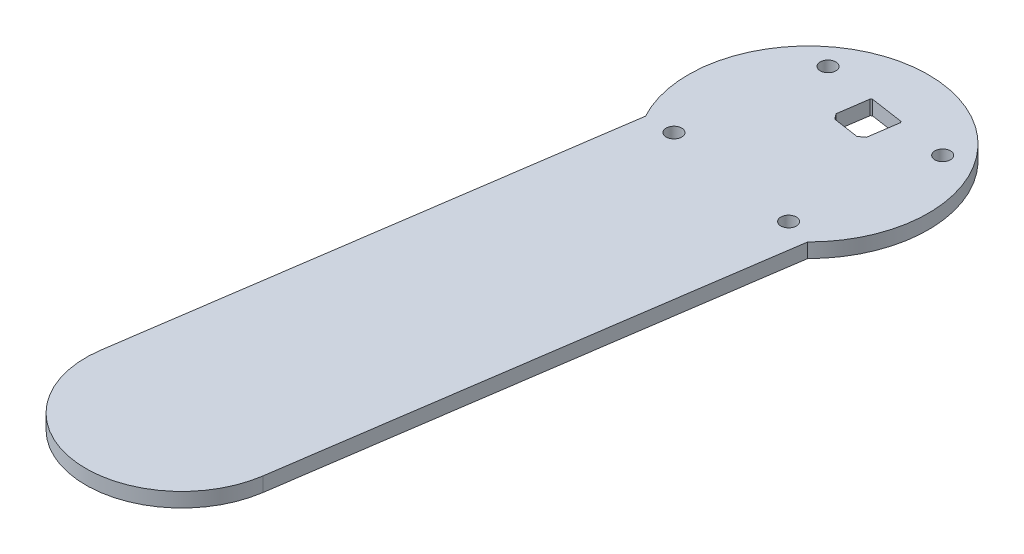
ISO-10303-21;
HEADER;
FILE_DESCRIPTION(('STEP AP214'),'2;1');
FILE_NAME('part.step','',(''),(''),'','','');
FILE_SCHEMA(('AUTOMOTIVE_DESIGN { 1 0 10303 214 1 1 1 1 }'));
ENDSEC;
DATA;
#1=APPLICATION_CONTEXT('core data for automotive mechanical design processes');
#2=APPLICATION_PROTOCOL_DEFINITION('international standard','automotive_design',2000,#1);
#3=PRODUCT_CONTEXT('',#1,'mechanical');
#4=PRODUCT('Part','Part','',(#3));
#5=PRODUCT_RELATED_PRODUCT_CATEGORY('part','',(#4));
#6=PRODUCT_DEFINITION_FORMATION('','',#4);
#7=PRODUCT_DEFINITION_CONTEXT('part definition',#1,'design');
#8=PRODUCT_DEFINITION('design','',#6,#7);
#9=PRODUCT_DEFINITION_SHAPE('','',#8);
#10=(LENGTH_UNIT() NAMED_UNIT(*) SI_UNIT(.MILLI.,.METRE.));
#11=(NAMED_UNIT(*) PLANE_ANGLE_UNIT() SI_UNIT($,.RADIAN.));
#12=(NAMED_UNIT(*) SI_UNIT($,.STERADIAN.) SOLID_ANGLE_UNIT());
#13=UNCERTAINTY_MEASURE_WITH_UNIT(LENGTH_MEASURE(1.E-05),#10,'distance_accuracy_value','');
#14=(GEOMETRIC_REPRESENTATION_CONTEXT(3) GLOBAL_UNCERTAINTY_ASSIGNED_CONTEXT((#13)) GLOBAL_UNIT_ASSIGNED_CONTEXT((#10,
#11,#12)) REPRESENTATION_CONTEXT('',''));
#15=CARTESIAN_POINT('',(0.,0.,0.));
#16=DIRECTION('',(0.,0.,1.));
#17=DIRECTION('',(1.,0.,0.));
#18=AXIS2_PLACEMENT_3D('',#15,#16,#17);
#19=CARTESIAN_POINT('',(-33.4112707494982,6.,227.560293080545));
#20=DIRECTION('',(0.,-1.,0.));
#21=DIRECTION('',(0.,0.,-1.));
#22=AXIS2_PLACEMENT_3D('',#19,#20,#21);
#23=CYLINDRICAL_SURFACE('',#22,40.);
#24=CARTESIAN_POINT('',(-33.4112707494982,0.,227.560293080545));
#25=DIRECTION('',(0.,1.,0.));
#26=DIRECTION('',(0.,0.,1.));
#27=AXIS2_PLACEMENT_3D('',#24,#25,#26);
#28=CIRCLE('',#27,40.);
#29=CARTESIAN_POINT('',(-72.9869738939404,0.,221.749637298024));
#30=VERTEX_POINT('',#29);
#31=CARTESIAN_POINT('',(6.16443239494501,0.,233.370948863067));
#32=VERTEX_POINT('',#31);
#33=EDGE_CURVE('E198',#30,#32,#28,.T.);
#34=ORIENTED_EDGE('',*,*,#33,.T.);
#35=DIRECTION('',(0.,-1.,0.));
#36=VECTOR('',#35,1.);
#37=CARTESIAN_POINT('',(6.16443239494501,6.,233.370948863067));
#38=LINE('',#37,#36);
#39=CARTESIAN_POINT('',(6.16443239494501,6.,233.370948863067));
#40=VERTEX_POINT('',#39);
#41=EDGE_CURVE('E225',#40,#32,#38,.T.);
#42=ORIENTED_EDGE('',*,*,#41,.F.);
#43=CARTESIAN_POINT('',(-33.4112707494982,6.,227.560293080545));
#44=DIRECTION('',(0.,1.,0.));
#45=DIRECTION('',(0.,0.,1.));
#46=AXIS2_PLACEMENT_3D('',#43,#44,#45);
#47=CIRCLE('',#46,40.);
#48=CARTESIAN_POINT('',(-72.9869738939404,6.,221.749637298024));
#49=VERTEX_POINT('',#48);
#50=EDGE_CURVE('E199',#49,#40,#47,.T.);
#51=ORIENTED_EDGE('',*,*,#50,.F.);
#52=DIRECTION('',(0.,-1.,0.));
#53=VECTOR('',#52,1.);
#54=CARTESIAN_POINT('',(-72.9869738939404,6.,221.749637298024));
#55=LINE('',#54,#53);
#56=EDGE_CURVE('E209',#49,#30,#55,.T.);
#57=ORIENTED_EDGE('',*,*,#56,.T.);
#58=EDGE_LOOP('',(#34,#42,#51,#57));
#59=FACE_BOUND('',#58,.T.);
#60=ADVANCED_FACE('F37',(#59),#23,.T.);
#61=CARTESIAN_POINT('',(6.16443239494501,6.,233.370948863067));
#62=DIRECTION('',(-0.989392578611067,0.,-0.145266394563033));
#63=DIRECTION('',(-0.145266394563033,0.,0.989392578611067));
#64=AXIS2_PLACEMENT_3D('',#61,#62,#63);
#65=PLANE('',#64);
#66=DIRECTION('',(0.145266394563033,0.,-0.989392578611067));
#67=VECTOR('',#66,1.);
#68=CARTESIAN_POINT('',(6.16443239494501,0.,233.370948863067));
#69=LINE('',#68,#67);
#70=CARTESIAN_POINT('',(35.2177113075516,0.,35.4924331408534));
#71=VERTEX_POINT('',#70);
#72=EDGE_CURVE('E212',#32,#71,#69,.T.);
#73=ORIENTED_EDGE('',*,*,#72,.T.);
#74=DIRECTION('',(0.,-1.,0.));
#75=VECTOR('',#74,1.);
#76=CARTESIAN_POINT('',(35.2177113075516,6.,35.4924331408534));
#77=LINE('',#76,#75);
#78=CARTESIAN_POINT('',(35.2177113075516,6.,35.4924331408534));
#79=VERTEX_POINT('',#78);
#80=EDGE_CURVE('E222',#79,#71,#77,.T.);
#81=ORIENTED_EDGE('',*,*,#80,.F.);
#82=DIRECTION('',(0.145266394563033,0.,-0.989392578611067));
#83=VECTOR('',#82,1.);
#84=CARTESIAN_POINT('',(6.16443239494501,6.,233.370948863067));
#85=LINE('',#84,#83);
#86=EDGE_CURVE('E202',#40,#79,#85,.T.);
#87=ORIENTED_EDGE('',*,*,#86,.F.);
#88=ORIENTED_EDGE('',*,*,#41,.T.);
#89=EDGE_LOOP('',(#73,#81,#87,#88));
#90=FACE_BOUND('',#89,.T.);
#91=ADVANCED_FACE('F278',(#90),#65,.F.);
#92=CARTESIAN_POINT('',(0.,6.,0.));
#93=DIRECTION('',(0.,-1.,0.));
#94=DIRECTION('',(0.,0.,-1.));
#95=AXIS2_PLACEMENT_3D('',#92,#93,#94);
#96=CYLINDRICAL_SURFACE('',#95,50.);
#97=CARTESIAN_POINT('',(0.,0.,0.));
#98=DIRECTION('',(0.,1.,0.));
#99=DIRECTION('',(0.,0.,1.));
#100=AXIS2_PLACEMENT_3D('',#97,#98,#99);
#101=CIRCLE('',#100,50.);
#102=CARTESIAN_POINT('',(-43.9336949813337,0.,23.8711215758107));
#103=VERTEX_POINT('',#102);
#104=EDGE_CURVE('E214',#71,#103,#101,.T.);
#105=ORIENTED_EDGE('',*,*,#104,.T.);
#106=DIRECTION('',(0.,-1.,0.));
#107=VECTOR('',#106,1.);
#108=CARTESIAN_POINT('',(-43.9336949813337,6.,23.8711215758107));
#109=LINE('',#108,#107);
#110=CARTESIAN_POINT('',(-43.9336949813337,6.,23.8711215758107));
#111=VERTEX_POINT('',#110);
#112=EDGE_CURVE('E219',#111,#103,#109,.T.);
#113=ORIENTED_EDGE('',*,*,#112,.F.);
#114=CARTESIAN_POINT('',(0.,6.,0.));
#115=DIRECTION('',(0.,1.,0.));
#116=DIRECTION('',(0.,0.,1.));
#117=AXIS2_PLACEMENT_3D('',#114,#115,#116);
#118=CIRCLE('',#117,50.);
#119=EDGE_CURVE('E205',#79,#111,#118,.T.);
#120=ORIENTED_EDGE('',*,*,#119,.F.);
#121=ORIENTED_EDGE('',*,*,#80,.T.);
#122=EDGE_LOOP('',(#105,#113,#120,#121));
#123=FACE_BOUND('',#122,.T.);
#124=ADVANCED_FACE('F283',(#123),#96,.T.);
#125=CARTESIAN_POINT('',(-43.9336949813337,6.,23.8711215758107));
#126=DIRECTION('',(0.989392578611067,0.,0.145266394563033));
#127=DIRECTION('',(0.145266394563033,0.,-0.989392578611068));
#128=AXIS2_PLACEMENT_3D('',#125,#126,#127);
#129=PLANE('',#128);
#130=DIRECTION('',(-0.145266394563033,0.,0.989392578611067));
#131=VECTOR('',#130,1.);
#132=CARTESIAN_POINT('',(-43.9336949813337,0.,23.8711215758107));
#133=LINE('',#132,#131);
#134=EDGE_CURVE('E203',#103,#30,#133,.T.);
#135=ORIENTED_EDGE('',*,*,#134,.T.);
#136=ORIENTED_EDGE('',*,*,#56,.F.);
#137=DIRECTION('',(-0.145266394563033,0.,0.989392578611067));
#138=VECTOR('',#137,1.);
#139=CARTESIAN_POINT('',(-43.9336949813337,6.,23.8711215758107));
#140=LINE('',#139,#138);
#141=EDGE_CURVE('E207',#111,#49,#140,.T.);
#142=ORIENTED_EDGE('',*,*,#141,.F.);
#143=ORIENTED_EDGE('',*,*,#112,.T.);
#144=EDGE_LOOP('',(#135,#136,#142,#143));
#145=FACE_BOUND('',#144,.T.);
#146=ADVANCED_FACE('F298',(#145),#129,.F.);
#147=CARTESIAN_POINT('',(-33.4112707494982,6.,227.560293080545));
#148=DIRECTION('',(0.,1.,0.));
#149=DIRECTION('',(0.,0.,1.));
#150=AXIS2_PLACEMENT_3D('',#147,#148,#149);
#151=PLANE('',#150);
#152=DIRECTION('',(0.802325054204414,0.,-0.596887348999696));
#153=VECTOR('',#152,1.);
#154=CARTESIAN_POINT('',(7.44405056486977,6.,-12.8390905031707));
#155=LINE('',#154,#153);
#156=CARTESIAN_POINT('',(7.44405056486977,6.,-12.8390905031707));
#157=VERTEX_POINT('',#156);
#158=CARTESIAN_POINT('',(9.71336851104499,6.,-14.5273428714993));
#159=VERTEX_POINT('',#158);
#160=EDGE_CURVE('E51',#157,#159,#155,.T.);
#161=ORIENTED_EDGE('',*,*,#160,.F.);
#162=DIRECTION('',(0.989392578625951,0.,0.145266394461661));
#163=VECTOR('',#162,1.);
#164=CARTESIAN_POINT('',(-3.4392678000157,6.,-14.437020842249));
#165=LINE('',#164,#163);
#166=CARTESIAN_POINT('',(-3.4392678000157,6.,-14.437020842249));
#167=VERTEX_POINT('',#166);
#168=EDGE_CURVE('E159',#167,#157,#165,.T.);
#169=ORIENTED_EDGE('',*,*,#168,.F.);
#170=DIRECTION('',(0.596887348999693,0.,0.802325054204416));
#171=VECTOR('',#170,1.);
#172=CARTESIAN_POINT('',(-5.12752016834428,6.,-16.7063387884242));
#173=LINE('',#172,#171);
#174=CARTESIAN_POINT('',(-5.12752016834428,6.,-16.7063387884242));
#175=VERTEX_POINT('',#174);
#176=EDGE_CURVE('E156',#175,#167,#173,.T.);
#177=ORIENTED_EDGE('',*,*,#176,.F.);
#178=DIRECTION('',(-0.145266394461661,0.,0.989392578625951));
#179=VECTOR('',#178,1.);
#180=CARTESIAN_POINT('',(-3.31169023757352,6.,-29.0737460212486));
#181=LINE('',#180,#179);
#182=CARTESIAN_POINT('',(-3.31169023757352,6.,-29.0737460212486));
#183=VERTEX_POINT('',#182);
#184=EDGE_CURVE('E153',#183,#175,#181,.T.);
#185=ORIENTED_EDGE('',*,*,#184,.F.);
#186=DIRECTION('',(-0.802325054204413,0.,0.596887348999697));
#187=VECTOR('',#186,1.);
#188=CARTESIAN_POINT('',(-2.74436075102969,6.,-29.4958091133308));
#189=LINE('',#188,#187);
#190=CARTESIAN_POINT('',(-2.74436075102969,6.,-29.4958091133308));
#191=VERTEX_POINT('',#190);
#192=EDGE_CURVE('E147',#191,#183,#189,.T.);
#193=ORIENTED_EDGE('',*,*,#192,.F.);
#194=DIRECTION('',(-0.989392578625951,0.,-0.145266394461661));
#195=VECTOR('',#194,1.);
#196=CARTESIAN_POINT('',(11.1071353497336,6.,-27.4620795908675));
#197=LINE('',#196,#195);
#198=CARTESIAN_POINT('',(11.1071353497336,6.,-27.4620795908675));
#199=VERTEX_POINT('',#198);
#200=EDGE_CURVE('E145',#199,#191,#197,.T.);
#201=ORIENTED_EDGE('',*,*,#200,.F.);
#202=DIRECTION('',(-0.596887348999705,0.,-0.802325054204407));
#203=VECTOR('',#202,1.);
#204=CARTESIAN_POINT('',(11.5291984418158,6.,-26.8947501043237));
#205=LINE('',#204,#203);
#206=CARTESIAN_POINT('',(11.5291984418158,6.,-26.8947501043237));
#207=VERTEX_POINT('',#206);
#208=EDGE_CURVE('E128',#207,#199,#205,.T.);
#209=ORIENTED_EDGE('',*,*,#208,.F.);
#210=DIRECTION('',(0.145266394461661,0.,-0.989392578625951));
#211=VECTOR('',#210,1.);
#212=CARTESIAN_POINT('',(9.71336851104499,6.,-14.5273428714993));
#213=LINE('',#212,#211);
#214=EDGE_CURVE('E137',#159,#207,#213,.T.);
#215=ORIENTED_EDGE('',*,*,#214,.F.);
#216=EDGE_LOOP('',(#161,#169,#177,#185,#193,#201,#209,#215));
#217=FACE_BOUND('',#216,.T.);
#218=CARTESIAN_POINT('',(-32.0930021682324,6.,23.8754939599125));
#219=DIRECTION('',(0.,1.,0.));
#220=DIRECTION('',(0.,0.,1.));
#221=AXIS2_PLACEMENT_3D('',#218,#219,#220);
#222=CIRCLE('',#221,3.24999999999999);
#223=CARTESIAN_POINT('',(-32.0930021682324,6.,27.1254939599125));
#224=VERTEX_POINT('',#223);
#225=EDGE_CURVE('E195',#224,#224,#222,.T.);
#226=ORIENTED_EDGE('',*,*,#225,.F.);
#227=EDGE_LOOP('',(#226));
#228=FACE_BOUND('',#227,.T.);
#229=CARTESIAN_POINT('',(23.8754939599136,6.,32.0930021682327));
#230=DIRECTION('',(0.,1.,0.));
#231=DIRECTION('',(0.,0.,1.));
#232=AXIS2_PLACEMENT_3D('',#229,#230,#231);
#233=CIRCLE('',#232,3.24999999999892);
#234=CARTESIAN_POINT('',(23.8754939599136,6.,35.3430021682316));
#235=VERTEX_POINT('',#234);
#236=EDGE_CURVE('E192',#235,#235,#233,.T.);
#237=ORIENTED_EDGE('',*,*,#236,.F.);
#238=EDGE_LOOP('',(#237));
#239=FACE_BOUND('',#238,.T.);
#240=CARTESIAN_POINT('',(32.0930021682336,6.,-23.8754939599139));
#241=DIRECTION('',(0.,1.,0.));
#242=DIRECTION('',(0.,0.,1.));
#243=AXIS2_PLACEMENT_3D('',#240,#241,#242);
#244=CIRCLE('',#243,3.24999999999887);
#245=CARTESIAN_POINT('',(32.0930021682336,6.,-20.6254939599151));
#246=VERTEX_POINT('',#245);
#247=EDGE_CURVE('E189',#246,#246,#244,.T.);
#248=ORIENTED_EDGE('',*,*,#247,.F.);
#249=EDGE_LOOP('',(#248));
#250=FACE_BOUND('',#249,.T.);
#251=CARTESIAN_POINT('',(-23.8754939599126,6.,-32.093002168234));
#252=DIRECTION('',(0.,1.,0.));
#253=DIRECTION('',(0.,0.,1.));
#254=AXIS2_PLACEMENT_3D('',#251,#252,#253);
#255=CIRCLE('',#254,3.25000000000035);
#256=CARTESIAN_POINT('',(-23.8754939599126,6.,-28.8430021682337));
#257=VERTEX_POINT('',#256);
#258=EDGE_CURVE('E178',#257,#257,#255,.T.);
#259=ORIENTED_EDGE('',*,*,#258,.F.);
#260=EDGE_LOOP('',(#259));
#261=FACE_BOUND('',#260,.T.);
#262=ORIENTED_EDGE('',*,*,#50,.T.);
#263=ORIENTED_EDGE('',*,*,#86,.T.);
#264=ORIENTED_EDGE('',*,*,#119,.T.);
#265=ORIENTED_EDGE('',*,*,#141,.T.);
#266=EDGE_LOOP('',(#262,#263,#264,#265));
#267=FACE_BOUND('',#266,.T.);
#268=ADVANCED_FACE('F141',(#217,#228,#239,#250,#261,#267),#151,.T.);
#269=CARTESIAN_POINT('',(-33.4112707494982,0.,227.560293080545));
#270=DIRECTION('',(0.,1.,0.));
#271=DIRECTION('',(0.,0.,1.));
#272=AXIS2_PLACEMENT_3D('',#269,#270,#271);
#273=PLANE('',#272);
#274=DIRECTION('',(0.989392578625951,0.,0.145266394461661));
#275=VECTOR('',#274,1.);
#276=CARTESIAN_POINT('',(2.00239136085633,0.,-13.6380556758769));
#277=LINE('',#276,#275);
#278=CARTESIAN_POINT('',(-3.4392678000157,0.,-14.437020842249));
#279=VERTEX_POINT('',#278);
#280=CARTESIAN_POINT('',(7.44405056486977,0.,-12.8390905031707));
#281=VERTEX_POINT('',#280);
#282=EDGE_CURVE('E44',#279,#281,#277,.T.);
#283=ORIENTED_EDGE('',*,*,#282,.T.);
#284=DIRECTION('',(0.802325054204414,0.,-0.596887348999696));
#285=VECTOR('',#284,1.);
#286=CARTESIAN_POINT('',(-133.982267056879,0.,92.3745998355174));
#287=LINE('',#286,#285);
#288=CARTESIAN_POINT('',(9.71336851104499,0.,-14.5273428714993));
#289=VERTEX_POINT('',#288);
#290=EDGE_CURVE('E11',#281,#289,#287,.T.);
#291=ORIENTED_EDGE('',*,*,#290,.T.);
#292=DIRECTION('',(0.145266394461661,0.,-0.989392578625951));
#293=VECTOR('',#292,1.);
#294=CARTESIAN_POINT('',(-25.9908263882328,0.,228.649791042175));
#295=LINE('',#294,#293);
#296=CARTESIAN_POINT('',(11.5291984418158,0.,-26.8947501043237));
#297=VERTEX_POINT('',#296);
#298=EDGE_CURVE('E228',#289,#297,#295,.T.);
#299=ORIENTED_EDGE('',*,*,#298,.T.);
#300=DIRECTION('',(-0.596887348999705,0.,-0.802325054204407));
#301=VECTOR('',#300,1.);
#302=CARTESIAN_POINT('',(117.375983400223,0.,115.382561722499));
#303=LINE('',#302,#301);
#304=CARTESIAN_POINT('',(11.1071353497336,0.,-27.4620795908675));
#305=VERTEX_POINT('',#304);
#306=EDGE_CURVE('E131',#297,#305,#303,.T.);
#307=ORIENTED_EDGE('',*,*,#306,.T.);
#308=DIRECTION('',(-0.989392578625951,0.,-0.145266394461661));
#309=VECTOR('',#308,1.);
#310=CARTESIAN_POINT('',(4.18138727778127,0.,-28.4789443552662));
#311=LINE('',#310,#309);
#312=CARTESIAN_POINT('',(-2.74436075102969,0.,-29.4958091133308));
#313=VERTEX_POINT('',#312);
#314=EDGE_CURVE('E231',#305,#313,#311,.T.);
#315=ORIENTED_EDGE('',*,*,#314,.T.);
#316=DIRECTION('',(-0.802325054204413,0.,0.596887348999697));
#317=VECTOR('',#316,1.);
#318=CARTESIAN_POINT('',(-145.589002089138,0.,76.7730389555633));
#319=LINE('',#318,#317);
#320=CARTESIAN_POINT('',(-3.31169023757352,0.,-29.0737460212486));
#321=VERTEX_POINT('',#320);
#322=EDGE_CURVE('E234',#313,#321,#319,.T.);
#323=ORIENTED_EDGE('',*,*,#322,.T.);
#324=DIRECTION('',(-0.145266394461661,0.,0.989392578625951));
#325=VECTOR('',#324,1.);
#326=CARTESIAN_POINT('',(-40.8317150676221,0.,226.47079512525));
#327=LINE('',#326,#325);
#328=CARTESIAN_POINT('',(-5.12752016834428,0.,-16.7063387884242));
#329=VERTEX_POINT('',#328);
#330=EDGE_CURVE('E237',#321,#329,#327,.T.);
#331=ORIENTED_EDGE('',*,*,#330,.T.);
#332=DIRECTION('',(0.596887348999693,0.,0.802325054204416));
#333=VECTOR('',#332,1.);
#334=CARTESIAN_POINT('',(101.774422520268,0.,126.989296754762));
#335=LINE('',#334,#333);
#336=EDGE_CURVE('E240',#329,#279,#335,.T.);
#337=ORIENTED_EDGE('',*,*,#336,.T.);
#338=EDGE_LOOP('',(#283,#291,#299,#307,#315,#323,#331,#337));
#339=FACE_BOUND('',#338,.T.);
#340=CARTESIAN_POINT('',(-32.0930021682324,0.,23.8754939599125));
#341=DIRECTION('',(0.,-1.,0.));
#342=DIRECTION('',(0.,0.,-1.));
#343=AXIS2_PLACEMENT_3D('',#340,#341,#342);
#344=CIRCLE('',#343,3.24999999999999);
#345=CARTESIAN_POINT('',(-32.0930021682324,0.,20.6254939599125));
#346=VERTEX_POINT('',#345);
#347=EDGE_CURVE('E175',#346,#346,#344,.T.);
#348=ORIENTED_EDGE('',*,*,#347,.F.);
#349=EDGE_LOOP('',(#348));
#350=FACE_BOUND('',#349,.T.);
#351=CARTESIAN_POINT('',(23.8754939599136,0.,32.0930021682327));
#352=DIRECTION('',(0.,-1.,0.));
#353=DIRECTION('',(0.,0.,-1.));
#354=AXIS2_PLACEMENT_3D('',#351,#352,#353);
#355=CIRCLE('',#354,3.24999999999892);
#356=CARTESIAN_POINT('',(23.8754939599136,0.,28.8430021682337));
#357=VERTEX_POINT('',#356);
#358=EDGE_CURVE('E179',#357,#357,#355,.T.);
#359=ORIENTED_EDGE('',*,*,#358,.F.);
#360=EDGE_LOOP('',(#359));
#361=FACE_BOUND('',#360,.T.);
#362=CARTESIAN_POINT('',(32.0930021682336,0.,-23.8754939599139));
#363=DIRECTION('',(0.,-1.,0.));
#364=DIRECTION('',(0.,0.,-1.));
#365=AXIS2_PLACEMENT_3D('',#362,#363,#364);
#366=CIRCLE('',#365,3.24999999999887);
#367=CARTESIAN_POINT('',(32.0930021682336,0.,-27.1254939599128));
#368=VERTEX_POINT('',#367);
#369=EDGE_CURVE('E182',#368,#368,#366,.T.);
#370=ORIENTED_EDGE('',*,*,#369,.F.);
#371=EDGE_LOOP('',(#370));
#372=FACE_BOUND('',#371,.T.);
#373=CARTESIAN_POINT('',(-23.8754939599126,0.,-32.093002168234));
#374=DIRECTION('',(0.,-1.,0.));
#375=DIRECTION('',(0.,0.,-1.));
#376=AXIS2_PLACEMENT_3D('',#373,#374,#375);
#377=CIRCLE('',#376,3.25000000000035);
#378=CARTESIAN_POINT('',(-23.8754939599126,0.,-35.3430021682344));
#379=VERTEX_POINT('',#378);
#380=EDGE_CURVE('E164',#379,#379,#377,.T.);
#381=ORIENTED_EDGE('',*,*,#380,.F.);
#382=EDGE_LOOP('',(#381));
#383=FACE_BOUND('',#382,.T.);
#384=ORIENTED_EDGE('',*,*,#33,.F.);
#385=ORIENTED_EDGE('',*,*,#134,.F.);
#386=ORIENTED_EDGE('',*,*,#104,.F.);
#387=ORIENTED_EDGE('',*,*,#72,.F.);
#388=EDGE_LOOP('',(#384,#385,#386,#387));
#389=FACE_BOUND('',#388,.T.);
#390=ADVANCED_FACE('F244',(#339,#350,#361,#372,#383,#389),#273,.F.);
#391=CARTESIAN_POINT('',(-23.8754939599126,28.,-32.093002168234));
#392=DIRECTION('',(0.,-1.,0.));
#393=DIRECTION('',(0.,0.,-1.));
#394=AXIS2_PLACEMENT_3D('',#391,#392,#393);
#395=CYLINDRICAL_SURFACE('',#394,3.25000000000035);
#396=ORIENTED_EDGE('',*,*,#258,.T.);
#397=EDGE_LOOP('',(#396));
#398=FACE_BOUND('',#397,.T.);
#399=ORIENTED_EDGE('',*,*,#380,.T.);
#400=EDGE_LOOP('',(#399));
#401=FACE_BOUND('',#400,.T.);
#402=ADVANCED_FACE('F309',(#398,#401),#395,.F.);
#403=CARTESIAN_POINT('',(32.0930021682336,28.,-23.8754939599139));
#404=DIRECTION('',(0.,-1.,0.));
#405=DIRECTION('',(0.,0.,-1.));
#406=AXIS2_PLACEMENT_3D('',#403,#404,#405);
#407=CYLINDRICAL_SURFACE('',#406,3.24999999999887);
#408=ORIENTED_EDGE('',*,*,#247,.T.);
#409=EDGE_LOOP('',(#408));
#410=FACE_BOUND('',#409,.T.);
#411=ORIENTED_EDGE('',*,*,#369,.T.);
#412=EDGE_LOOP('',(#411));
#413=FACE_BOUND('',#412,.T.);
#414=ADVANCED_FACE('F314',(#410,#413),#407,.F.);
#415=CARTESIAN_POINT('',(23.8754939599136,28.,32.0930021682327));
#416=DIRECTION('',(0.,-1.,0.));
#417=DIRECTION('',(0.,0.,-1.));
#418=AXIS2_PLACEMENT_3D('',#415,#416,#417);
#419=CYLINDRICAL_SURFACE('',#418,3.24999999999892);
#420=ORIENTED_EDGE('',*,*,#236,.T.);
#421=EDGE_LOOP('',(#420));
#422=FACE_BOUND('',#421,.T.);
#423=ORIENTED_EDGE('',*,*,#358,.T.);
#424=EDGE_LOOP('',(#423));
#425=FACE_BOUND('',#424,.T.);
#426=ADVANCED_FACE('F273',(#422,#425),#419,.F.);
#427=CARTESIAN_POINT('',(-32.0930021682324,28.,23.8754939599125));
#428=DIRECTION('',(0.,-1.,0.));
#429=DIRECTION('',(0.,0.,-1.));
#430=AXIS2_PLACEMENT_3D('',#427,#428,#429);
#431=CYLINDRICAL_SURFACE('',#430,3.24999999999999);
#432=ORIENTED_EDGE('',*,*,#225,.T.);
#433=EDGE_LOOP('',(#432));
#434=FACE_BOUND('',#433,.T.);
#435=ORIENTED_EDGE('',*,*,#347,.T.);
#436=EDGE_LOOP('',(#435));
#437=FACE_BOUND('',#436,.T.);
#438=ADVANCED_FACE('F266',(#434,#437),#431,.F.);
#439=CARTESIAN_POINT('',(7.44405056486977,-29.,-12.8390905031707));
#440=DIRECTION('',(0.596887348999696,0.,0.802325054204414));
#441=DIRECTION('',(0.802325054204414,0.,-0.596887348999696));
#442=AXIS2_PLACEMENT_3D('',#439,#440,#441);
#443=PLANE('',#442);
#444=DIRECTION('',(0.,1.,0.));
#445=VECTOR('',#444,1.);
#446=CARTESIAN_POINT('',(7.44405056486977,-29.,-12.8390905031707));
#447=LINE('',#446,#445);
#448=EDGE_CURVE('E162',#281,#157,#447,.T.);
#449=ORIENTED_EDGE('',*,*,#448,.T.);
#450=ORIENTED_EDGE('',*,*,#160,.T.);
#451=DIRECTION('',(0.,1.,0.));
#452=VECTOR('',#451,1.);
#453=CARTESIAN_POINT('',(9.71336851104499,-29.,-14.5273428714993));
#454=LINE('',#453,#452);
#455=EDGE_CURVE('E134',#289,#159,#454,.T.);
#456=ORIENTED_EDGE('',*,*,#455,.F.);
#457=ORIENTED_EDGE('',*,*,#290,.F.);
#458=EDGE_LOOP('',(#449,#450,#456,#457));
#459=FACE_BOUND('',#458,.T.);
#460=ADVANCED_FACE('F264',(#459),#443,.F.);
#461=CARTESIAN_POINT('',(-3.4392678000157,-29.,-14.437020842249));
#462=DIRECTION('',(-0.145266394461661,0.,0.989392578625951));
#463=DIRECTION('',(0.989392578625951,0.,0.145266394461661));
#464=AXIS2_PLACEMENT_3D('',#461,#462,#463);
#465=PLANE('',#464);
#466=DIRECTION('',(0.,1.,0.));
#467=VECTOR('',#466,1.);
#468=CARTESIAN_POINT('',(-3.4392678000157,-29.,-14.437020842249));
#469=LINE('',#468,#467);
#470=EDGE_CURVE('E165',#279,#167,#469,.T.);
#471=ORIENTED_EDGE('',*,*,#470,.T.);
#472=ORIENTED_EDGE('',*,*,#168,.T.);
#473=ORIENTED_EDGE('',*,*,#448,.F.);
#474=ORIENTED_EDGE('',*,*,#282,.F.);
#475=EDGE_LOOP('',(#471,#472,#473,#474));
#476=FACE_BOUND('',#475,.T.);
#477=ADVANCED_FACE('F249',(#476),#465,.F.);
#478=CARTESIAN_POINT('',(-5.12752016834428,-29.,-16.7063387884242));
#479=DIRECTION('',(-0.802325054204416,0.,0.596887348999693));
#480=DIRECTION('',(0.596887348999693,0.,0.802325054204416));
#481=AXIS2_PLACEMENT_3D('',#478,#479,#480);
#482=PLANE('',#481);
#483=DIRECTION('',(0.,1.,0.));
#484=VECTOR('',#483,1.);
#485=CARTESIAN_POINT('',(-5.12752016834428,-29.,-16.7063387884242));
#486=LINE('',#485,#484);
#487=EDGE_CURVE('E167',#329,#175,#486,.T.);
#488=ORIENTED_EDGE('',*,*,#487,.T.);
#489=ORIENTED_EDGE('',*,*,#176,.T.);
#490=ORIENTED_EDGE('',*,*,#470,.F.);
#491=ORIENTED_EDGE('',*,*,#336,.F.);
#492=EDGE_LOOP('',(#488,#489,#490,#491));
#493=FACE_BOUND('',#492,.T.);
#494=ADVANCED_FACE('F251',(#493),#482,.F.);
#495=CARTESIAN_POINT('',(-3.31169023757352,-29.,-29.0737460212486));
#496=DIRECTION('',(-0.989392578625951,0.,-0.145266394461661));
#497=DIRECTION('',(-0.145266394461661,0.,0.989392578625951));
#498=AXIS2_PLACEMENT_3D('',#495,#496,#497);
#499=PLANE('',#498);
#500=DIRECTION('',(0.,1.,0.));
#501=VECTOR('',#500,1.);
#502=CARTESIAN_POINT('',(-3.31169023757352,-29.,-29.0737460212486));
#503=LINE('',#502,#501);
#504=EDGE_CURVE('E169',#321,#183,#503,.T.);
#505=ORIENTED_EDGE('',*,*,#504,.T.);
#506=ORIENTED_EDGE('',*,*,#184,.T.);
#507=ORIENTED_EDGE('',*,*,#487,.F.);
#508=ORIENTED_EDGE('',*,*,#330,.F.);
#509=EDGE_LOOP('',(#505,#506,#507,#508));
#510=FACE_BOUND('',#509,.T.);
#511=ADVANCED_FACE('F257',(#510),#499,.F.);
#512=CARTESIAN_POINT('',(-2.74436075102969,-29.,-29.4958091133308));
#513=DIRECTION('',(-0.596887348999697,0.,-0.802325054204413));
#514=DIRECTION('',(-0.802325054204413,0.,0.596887348999697));
#515=AXIS2_PLACEMENT_3D('',#512,#513,#514);
#516=PLANE('',#515);
#517=DIRECTION('',(0.,1.,0.));
#518=VECTOR('',#517,1.);
#519=CARTESIAN_POINT('',(-2.74436075102969,-29.,-29.4958091133308));
#520=LINE('',#519,#518);
#521=EDGE_CURVE('E171',#313,#191,#520,.T.);
#522=ORIENTED_EDGE('',*,*,#521,.T.);
#523=ORIENTED_EDGE('',*,*,#192,.T.);
#524=ORIENTED_EDGE('',*,*,#504,.F.);
#525=ORIENTED_EDGE('',*,*,#322,.F.);
#526=EDGE_LOOP('',(#522,#523,#524,#525));
#527=FACE_BOUND('',#526,.T.);
#528=ADVANCED_FACE('F260',(#527),#516,.F.);
#529=CARTESIAN_POINT('',(11.1071353497336,-29.,-27.4620795908675));
#530=DIRECTION('',(0.145266394461661,0.,-0.989392578625951));
#531=DIRECTION('',(-0.989392578625951,0.,-0.145266394461661));
#532=AXIS2_PLACEMENT_3D('',#529,#530,#531);
#533=PLANE('',#532);
#534=DIRECTION('',(0.,1.,0.));
#535=VECTOR('',#534,1.);
#536=CARTESIAN_POINT('',(11.1071353497336,-29.,-27.4620795908675));
#537=LINE('',#536,#535);
#538=EDGE_CURVE('E133',#305,#199,#537,.T.);
#539=ORIENTED_EDGE('',*,*,#538,.T.);
#540=ORIENTED_EDGE('',*,*,#200,.T.);
#541=ORIENTED_EDGE('',*,*,#521,.F.);
#542=ORIENTED_EDGE('',*,*,#314,.F.);
#543=EDGE_LOOP('',(#539,#540,#541,#542));
#544=FACE_BOUND('',#543,.T.);
#545=ADVANCED_FACE('F263',(#544),#533,.F.);
#546=CARTESIAN_POINT('',(11.5291984418158,-29.,-26.8947501043237));
#547=DIRECTION('',(0.802325054204407,0.,-0.596887348999705));
#548=DIRECTION('',(-0.596887348999705,0.,-0.802325054204407));
#549=AXIS2_PLACEMENT_3D('',#546,#547,#548);
#550=PLANE('',#549);
#551=DIRECTION('',(0.,1.,0.));
#552=VECTOR('',#551,1.);
#553=CARTESIAN_POINT('',(11.5291984418158,-29.,-26.8947501043237));
#554=LINE('',#553,#552);
#555=EDGE_CURVE('E59',#297,#207,#554,.T.);
#556=ORIENTED_EDGE('',*,*,#555,.T.);
#557=ORIENTED_EDGE('',*,*,#208,.T.);
#558=ORIENTED_EDGE('',*,*,#538,.F.);
#559=ORIENTED_EDGE('',*,*,#306,.F.);
#560=EDGE_LOOP('',(#556,#557,#558,#559));
#561=FACE_BOUND('',#560,.T.);
#562=ADVANCED_FACE('F125',(#561),#550,.F.);
#563=CARTESIAN_POINT('',(9.71336851104499,-29.,-14.5273428714993));
#564=DIRECTION('',(0.989392578625951,0.,0.145266394461661));
#565=DIRECTION('',(0.145266394461661,0.,-0.989392578625951));
#566=AXIS2_PLACEMENT_3D('',#563,#564,#565);
#567=PLANE('',#566);
#568=ORIENTED_EDGE('',*,*,#455,.T.);
#569=ORIENTED_EDGE('',*,*,#214,.T.);
#570=ORIENTED_EDGE('',*,*,#555,.F.);
#571=ORIENTED_EDGE('',*,*,#298,.F.);
#572=EDGE_LOOP('',(#568,#569,#570,#571));
#573=FACE_BOUND('',#572,.T.);
#574=ADVANCED_FACE('F138',(#573),#567,.F.);
#575=CLOSED_SHELL('',(#60,#91,#124,#146,#268,#390,#402,#414,#426,#438,#460,#477,#494,#511,#528,
#545,#562,#574));
#576=MANIFOLD_SOLID_BREP('B2',#575);
#577=ADVANCED_BREP_SHAPE_REPRESENTATION('',(#18,#576),#14);
#578=SHAPE_DEFINITION_REPRESENTATION(#9,#577);
ENDSEC;
END-ISO-10303-21;
